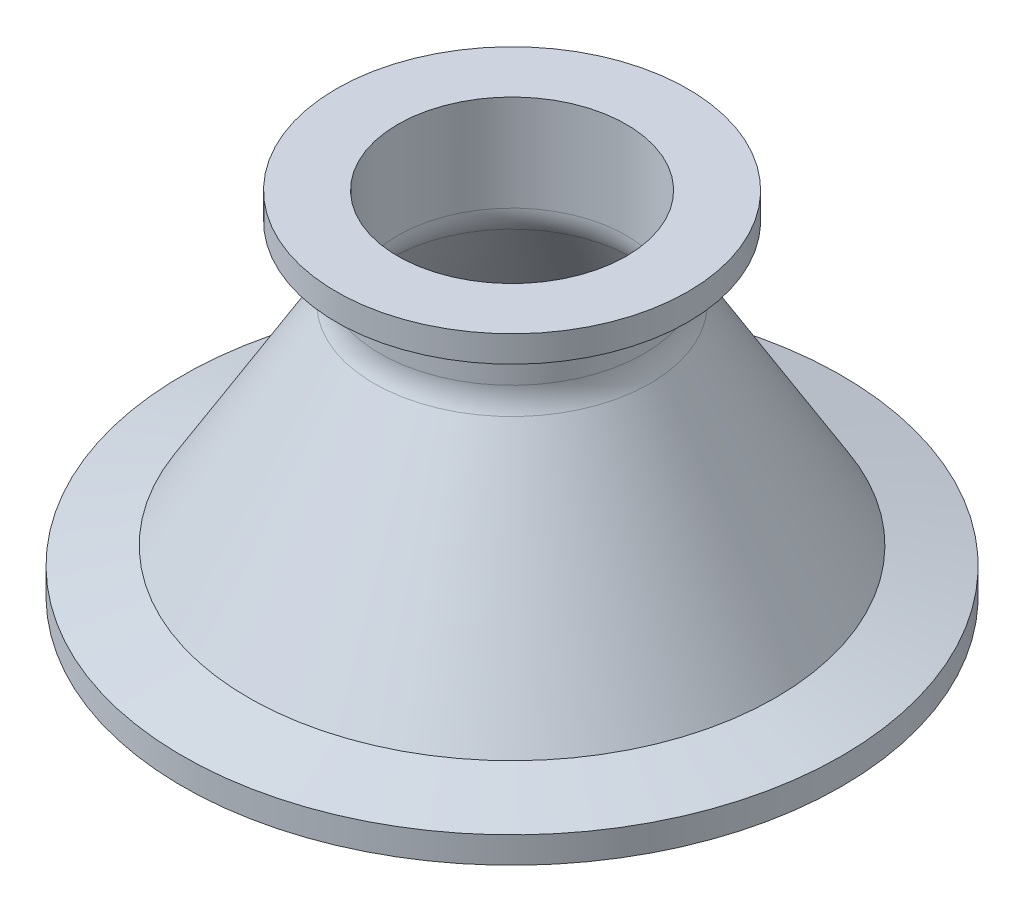
ISO-10303-21;
HEADER;
FILE_DESCRIPTION(('STEP AP214'),'2;1');
FILE_NAME('part.step','',(''),(''),'','','');
FILE_SCHEMA(('AUTOMOTIVE_DESIGN { 1 0 10303 214 1 1 1 1 }'));
ENDSEC;
DATA;
#1=APPLICATION_CONTEXT('core data for automotive mechanical design processes');
#2=APPLICATION_PROTOCOL_DEFINITION('international standard','automotive_design',2000,#1);
#3=PRODUCT_CONTEXT('',#1,'mechanical');
#4=PRODUCT('Part','Part','',(#3));
#5=PRODUCT_RELATED_PRODUCT_CATEGORY('part','',(#4));
#6=PRODUCT_DEFINITION_FORMATION('','',#4);
#7=PRODUCT_DEFINITION_CONTEXT('part definition',#1,'design');
#8=PRODUCT_DEFINITION('design','',#6,#7);
#9=PRODUCT_DEFINITION_SHAPE('','',#8);
#10=(LENGTH_UNIT() NAMED_UNIT(*) SI_UNIT(.MILLI.,.METRE.));
#11=(NAMED_UNIT(*) PLANE_ANGLE_UNIT() SI_UNIT($,.RADIAN.));
#12=(NAMED_UNIT(*) SI_UNIT($,.STERADIAN.) SOLID_ANGLE_UNIT());
#13=UNCERTAINTY_MEASURE_WITH_UNIT(LENGTH_MEASURE(1.E-05),#10,'distance_accuracy_value','');
#14=(GEOMETRIC_REPRESENTATION_CONTEXT(3) GLOBAL_UNCERTAINTY_ASSIGNED_CONTEXT((#13)) GLOBAL_UNIT_ASSIGNED_CONTEXT((#10,
#11,#12)) REPRESENTATION_CONTEXT('',''));
#15=CARTESIAN_POINT('',(0.,0.,0.));
#16=DIRECTION('',(0.,0.,1.));
#17=DIRECTION('',(1.,0.,0.));
#18=AXIS2_PLACEMENT_3D('',#15,#16,#17);
#19=CARTESIAN_POINT('',(0.,4.615080175258,0.));
#20=DIRECTION('',(0.,-1.,0.));
#21=DIRECTION('',(-0.999975299857432,0.,0.00702849023888623));
#22=AXIS2_PLACEMENT_3D('',#19,#20,#21);
#23=TOROIDAL_SURFACE('',#22,21.,5.);
#24=CARTESIAN_POINT('',(0.,7.187558952395,0.));
#25=DIRECTION('',(0.,-1.,0.));
#26=DIRECTION('',(1.,0.,0.));
#27=AXIS2_PLACEMENT_3D('',#24,#25,#26);
#28=CIRCLE('',#27,25.28746462856);
#29=CARTESIAN_POINT('',(25.2874646285601,7.18755895239509,0.));
#30=VERTEX_POINT('',#29);
#31=CARTESIAN_POINT('',(25.2868400245785,7.187558952395,-0.177732698308012));
#32=VERTEX_POINT('',#31);
#33=EDGE_CURVE('E192',#30,#32,#28,.T.);
#34=ORIENTED_EDGE('',*,*,#33,.F.);
#35=CARTESIAN_POINT('',(0.,7.187558952395,0.));
#36=DIRECTION('',(0.,-1.,0.));
#37=DIRECTION('',(1.,0.,0.));
#38=AXIS2_PLACEMENT_3D('',#35,#36,#37);
#39=CIRCLE('',#38,25.28746462856);
#40=EDGE_CURVE('E90',#32,#30,#39,.T.);
#41=ORIENTED_EDGE('',*,*,#40,.F.);
#42=CARTESIAN_POINT('',(20.9994812970061,4.615080175258,-0.147598295016608));
#43=DIRECTION('',(-0.00702849023888611,0.,-0.999975299857432));
#44=DIRECTION('',(0.999975299857432,0.,-0.00702849023888611));
#45=AXIS2_PLACEMENT_3D('',#42,#43,#44);
#46=CIRCLE('',#45,5.);
#47=CARTESIAN_POINT('',(25.9993577962932,4.615080175258,-0.182740746211039));
#48=VERTEX_POINT('',#47);
#49=EDGE_CURVE('E11',#32,#48,#46,.T.);
#50=ORIENTED_EDGE('',*,*,#49,.T.);
#51=CARTESIAN_POINT('',(0.,4.615080175258,0.));
#52=DIRECTION('',(0.,-1.,0.));
#53=DIRECTION('',(-1.,0.,0.));
#54=AXIS2_PLACEMENT_3D('',#51,#52,#53);
#55=CIRCLE('',#54,26.);
#56=CARTESIAN_POINT('',(26.,4.615080175258,0.));
#57=VERTEX_POINT('',#56);
#58=EDGE_CURVE('E28',#48,#57,#55,.T.);
#59=ORIENTED_EDGE('',*,*,#58,.T.);
#60=CARTESIAN_POINT('',(0.,4.615080175258,0.));
#61=DIRECTION('',(0.,-1.,0.));
#62=DIRECTION('',(-1.,0.,0.));
#63=AXIS2_PLACEMENT_3D('',#60,#61,#62);
#64=CIRCLE('',#63,26.);
#65=EDGE_CURVE('E198',#57,#48,#64,.T.);
#66=ORIENTED_EDGE('',*,*,#65,.T.);
#67=ORIENTED_EDGE('',*,*,#49,.F.);
#68=EDGE_LOOP('',(#34,#41,#50,#59,#66,#67));
#69=FACE_BOUND('',#68,.T.);
#70=ADVANCED_FACE('F17',(#69),#23,.F.);
#71=CARTESIAN_POINT('',(0.,42.,0.));
#72=DIRECTION('',(0.,-1.,0.));
#73=DIRECTION('',(-1.,0.,0.));
#74=AXIS2_PLACEMENT_3D('',#71,#72,#73);
#75=CYLINDRICAL_SURFACE('',#74,26.);
#76=ORIENTED_EDGE('',*,*,#65,.F.);
#77=DIRECTION('',(0.,-1.,0.));
#78=VECTOR('',#77,1.);
#79=CARTESIAN_POINT('',(26.,42.,0.));
#80=LINE('',#79,#78);
#81=CARTESIAN_POINT('',(26.,0.,0.));
#82=VERTEX_POINT('',#81);
#83=EDGE_CURVE('E194',#57,#82,#80,.T.);
#84=ORIENTED_EDGE('',*,*,#83,.T.);
#85=CARTESIAN_POINT('',(0.,0.,0.));
#86=DIRECTION('',(0.,1.,0.));
#87=DIRECTION('',(1.,0.,0.));
#88=AXIS2_PLACEMENT_3D('',#85,#86,#87);
#89=CIRCLE('',#88,26.);
#90=EDGE_CURVE('E184',#82,#82,#89,.T.);
#91=ORIENTED_EDGE('',*,*,#90,.F.);
#92=ORIENTED_EDGE('',*,*,#83,.F.);
#93=ORIENTED_EDGE('',*,*,#58,.F.);
#94=EDGE_LOOP('',(#76,#84,#91,#92,#93));
#95=FACE_BOUND('',#94,.T.);
#96=ADVANCED_FACE('F271',(#95),#75,.F.);
#97=CARTESIAN_POINT('',(0.,0.,0.));
#98=DIRECTION('',(0.,-1.,0.));
#99=DIRECTION('',(0.,0.,-1.));
#100=AXIS2_PLACEMENT_3D('',#97,#98,#99);
#101=PLANE('',#100);
#102=ORIENTED_EDGE('',*,*,#90,.T.);
#103=EDGE_LOOP('',(#102));
#104=FACE_BOUND('',#103,.T.);
#105=CARTESIAN_POINT('',(0.,0.,0.));
#106=DIRECTION('',(0.,1.,0.));
#107=DIRECTION('',(1.,0.,0.));
#108=AXIS2_PLACEMENT_3D('',#105,#106,#107);
#109=CIRCLE('',#108,37.5);
#110=CARTESIAN_POINT('',(37.5,0.,0.));
#111=VERTEX_POINT('',#110);
#112=EDGE_CURVE('E185',#111,#111,#109,.T.);
#113=ORIENTED_EDGE('',*,*,#112,.F.);
#114=EDGE_LOOP('',(#113));
#115=FACE_BOUND('',#114,.T.);
#116=ADVANCED_FACE('F273',(#104,#115),#101,.T.);
#117=CARTESIAN_POINT('',(0.,42.,0.));
#118=DIRECTION('',(0.,-1.,0.));
#119=DIRECTION('',(-1.,0.,0.));
#120=AXIS2_PLACEMENT_3D('',#117,#118,#119);
#121=CYLINDRICAL_SURFACE('',#120,37.5);
#122=ORIENTED_EDGE('',*,*,#112,.T.);
#123=DIRECTION('',(0.,1.,0.));
#124=VECTOR('',#123,1.);
#125=CARTESIAN_POINT('',(37.5,42.,0.));
#126=LINE('',#125,#124);
#127=CARTESIAN_POINT('',(37.5,2.99999999999984,0.));
#128=VERTEX_POINT('',#127);
#129=EDGE_CURVE('E182',#111,#128,#126,.T.);
#130=ORIENTED_EDGE('',*,*,#129,.T.);
#131=CARTESIAN_POINT('',(0.,3.,0.));
#132=DIRECTION('',(0.,1.,0.));
#133=DIRECTION('',(1.,0.,0.));
#134=AXIS2_PLACEMENT_3D('',#131,#132,#133);
#135=CIRCLE('',#134,37.5);
#136=EDGE_CURVE('E212',#128,#128,#135,.T.);
#137=ORIENTED_EDGE('',*,*,#136,.F.);
#138=ORIENTED_EDGE('',*,*,#129,.F.);
#139=EDGE_LOOP('',(#122,#130,#137,#138));
#140=FACE_BOUND('',#139,.T.);
#141=ADVANCED_FACE('F276',(#140),#121,.T.);
#142=CARTESIAN_POINT('',(0.,4.,0.));
#143=DIRECTION('',(0.,-1.,0.));
#144=DIRECTION('',(-1.,0.,0.));
#145=AXIS2_PLACEMENT_3D('',#142,#143,#144);
#146=CONICAL_SURFACE('',#145,33.75,1.31019393504751);
#147=ORIENTED_EDGE('',*,*,#136,.T.);
#148=DIRECTION('',(-0.966234939601235,0.257662650560374,0.));
#149=VECTOR('',#148,1.);
#150=CARTESIAN_POINT('',(33.75,4.,0.));
#151=LINE('',#150,#149);
#152=CARTESIAN_POINT('',(30.,5.,0.));
#153=VERTEX_POINT('',#152);
#154=EDGE_CURVE('E21',#128,#153,#151,.T.);
#155=ORIENTED_EDGE('',*,*,#154,.T.);
#156=CARTESIAN_POINT('',(0.,5.,0.));
#157=DIRECTION('',(0.,-1.,0.));
#158=DIRECTION('',(1.,0.,0.));
#159=AXIS2_PLACEMENT_3D('',#156,#157,#158);
#160=CIRCLE('',#159,30.);
#161=EDGE_CURVE('E178',#153,#153,#160,.T.);
#162=ORIENTED_EDGE('',*,*,#161,.T.);
#163=ORIENTED_EDGE('',*,*,#154,.F.);
#164=EDGE_LOOP('',(#147,#155,#162,#163));
#165=FACE_BOUND('',#164,.T.);
#166=ADVANCED_FACE('F281',(#165),#146,.T.);
#167=CARTESIAN_POINT('',(0.,16.9062205238,0.));
#168=DIRECTION('',(0.,-1.,0.));
#169=DIRECTION('',(-1.,0.,0.));
#170=AXIS2_PLACEMENT_3D('',#167,#168,#169);
#171=CONICAL_SURFACE('',#170,22.85626768572,0.540419500270523);
#172=ORIENTED_EDGE('',*,*,#161,.F.);
#173=DIRECTION('',(-0.514495755427474,0.857492925712576,0.));
#174=VECTOR('',#173,1.);
#175=CARTESIAN_POINT('',(22.85626768572,16.9062205238,0.));
#176=LINE('',#175,#174);
#177=CARTESIAN_POINT('',(15.7125353714407,28.8124410476004,0.));
#178=VERTEX_POINT('',#177);
#179=EDGE_CURVE('E181',#153,#178,#176,.T.);
#180=ORIENTED_EDGE('',*,*,#179,.T.);
#181=CARTESIAN_POINT('',(0.,28.8124410476,0.));
#182=DIRECTION('',(0.,-1.,0.));
#183=DIRECTION('',(-1.,0.,0.));
#184=AXIS2_PLACEMENT_3D('',#181,#182,#183);
#185=CIRCLE('',#184,15.71253537144);
#186=CARTESIAN_POINT('',(15.7120637266121,28.8124410476,-0.12174255473111));
#187=VERTEX_POINT('',#186);
#188=EDGE_CURVE('E230',#178,#187,#185,.T.);
#189=ORIENTED_EDGE('',*,*,#188,.T.);
#190=CARTESIAN_POINT('',(0.,28.8124410476,0.));
#191=DIRECTION('',(0.,-1.,0.));
#192=DIRECTION('',(-1.,0.,0.));
#193=AXIS2_PLACEMENT_3D('',#190,#191,#192);
#194=CIRCLE('',#193,15.71253537144);
#195=EDGE_CURVE('E242',#187,#178,#194,.T.);
#196=ORIENTED_EDGE('',*,*,#195,.T.);
#197=ORIENTED_EDGE('',*,*,#179,.F.);
#198=EDGE_LOOP('',(#172,#180,#189,#196,#197));
#199=FACE_BOUND('',#198,.T.);
#200=ADVANCED_FACE('F420',(#199),#171,.T.);
#201=CARTESIAN_POINT('',(0.,31.38491982474,0.));
#202=DIRECTION('',(0.,-1.,0.));
#203=DIRECTION('',(-0.999969982894758,0.,0.00774811651036267));
#204=AXIS2_PLACEMENT_3D('',#201,#202,#203);
#205=TOROIDAL_SURFACE('',#204,20.,5.);
#206=ORIENTED_EDGE('',*,*,#188,.F.);
#207=ORIENTED_EDGE('',*,*,#195,.F.);
#208=CARTESIAN_POINT('',(19.9993996578952,31.38491982474,-0.154962330207251));
#209=DIRECTION('',(-0.00774811651036255,0.,-0.999969982894758));
#210=DIRECTION('',(0.999969982894758,0.,-0.00774811651036255));
#211=AXIS2_PLACEMENT_3D('',#208,#209,#210);
#212=CIRCLE('',#211,5.);
#213=CARTESIAN_POINT('',(14.9995497434214,31.38491982474,-0.116221747655438));
#214=VERTEX_POINT('',#213);
#215=EDGE_CURVE('E129',#187,#214,#212,.T.);
#216=ORIENTED_EDGE('',*,*,#215,.T.);
#217=CARTESIAN_POINT('',(0.,31.38491982474,0.));
#218=DIRECTION('',(0.,-1.,0.));
#219=DIRECTION('',(-1.,0.,0.));
#220=AXIS2_PLACEMENT_3D('',#217,#218,#219);
#221=CIRCLE('',#220,15.);
#222=CARTESIAN_POINT('',(15.,31.38491982474,0.));
#223=VERTEX_POINT('',#222);
#224=EDGE_CURVE('E225',#214,#223,#221,.T.);
#225=ORIENTED_EDGE('',*,*,#224,.T.);
#226=CARTESIAN_POINT('',(0.,31.38491982474,0.));
#227=DIRECTION('',(0.,-1.,0.));
#228=DIRECTION('',(-1.,0.,0.));
#229=AXIS2_PLACEMENT_3D('',#226,#227,#228);
#230=CIRCLE('',#229,15.);
#231=EDGE_CURVE('E209',#223,#214,#230,.T.);
#232=ORIENTED_EDGE('',*,*,#231,.T.);
#233=ORIENTED_EDGE('',*,*,#215,.F.);
#234=EDGE_LOOP('',(#206,#207,#216,#225,#232,#233));
#235=FACE_BOUND('',#234,.T.);
#236=ADVANCED_FACE('F428',(#235),#205,.F.);
#237=CARTESIAN_POINT('',(0.,42.,0.));
#238=DIRECTION('',(0.,-1.,0.));
#239=DIRECTION('',(-1.,0.,0.));
#240=AXIS2_PLACEMENT_3D('',#237,#238,#239);
#241=CYLINDRICAL_SURFACE('',#240,15.);
#242=ORIENTED_EDGE('',*,*,#231,.F.);
#243=DIRECTION('',(0.,1.,0.));
#244=VECTOR('',#243,1.);
#245=CARTESIAN_POINT('',(15.,42.,0.));
#246=LINE('',#245,#244);
#247=CARTESIAN_POINT('',(15.,35.,0.));
#248=VERTEX_POINT('',#247);
#249=EDGE_CURVE('E105',#223,#248,#246,.T.);
#250=ORIENTED_EDGE('',*,*,#249,.T.);
#251=CARTESIAN_POINT('',(0.,35.,0.));
#252=DIRECTION('',(0.,1.,0.));
#253=DIRECTION('',(1.,0.,0.));
#254=AXIS2_PLACEMENT_3D('',#251,#252,#253);
#255=CIRCLE('',#254,15.);
#256=CARTESIAN_POINT('',(-15.,35.,0.));
#257=VERTEX_POINT('',#256);
#258=EDGE_CURVE('E154',#257,#248,#255,.T.);
#259=ORIENTED_EDGE('',*,*,#258,.F.);
#260=CARTESIAN_POINT('',(0.,35.,0.));
#261=DIRECTION('',(0.,1.,0.));
#262=DIRECTION('',(1.,0.,0.));
#263=AXIS2_PLACEMENT_3D('',#260,#261,#262);
#264=CIRCLE('',#263,15.);
#265=EDGE_CURVE('E118',#248,#257,#264,.T.);
#266=ORIENTED_EDGE('',*,*,#265,.F.);
#267=ORIENTED_EDGE('',*,*,#249,.F.);
#268=ORIENTED_EDGE('',*,*,#224,.F.);
#269=EDGE_LOOP('',(#242,#250,#259,#266,#267,#268));
#270=FACE_BOUND('',#269,.T.);
#271=ADVANCED_FACE('F403',(#270),#241,.T.);
#272=CARTESIAN_POINT('',(0.,36.,0.));
#273=DIRECTION('',(0.,1.,0.));
#274=DIRECTION('',(1.,0.,0.));
#275=AXIS2_PLACEMENT_3D('',#272,#273,#274);
#276=CONICAL_SURFACE('',#275,17.5,1.19028994968256);
#277=CARTESIAN_POINT('',(0.,37.,0.));
#278=DIRECTION('',(0.,1.,0.));
#279=DIRECTION('',(1.,0.,0.));
#280=AXIS2_PLACEMENT_3D('',#277,#278,#279);
#281=CIRCLE('',#280,20.);
#282=CARTESIAN_POINT('',(-20.,37.,0.));
#283=VERTEX_POINT('',#282);
#284=CARTESIAN_POINT('',(20.,37.,0.));
#285=VERTEX_POINT('',#284);
#286=EDGE_CURVE('E159',#283,#285,#281,.T.);
#287=ORIENTED_EDGE('',*,*,#286,.F.);
#288=DIRECTION('',(0.928476690885271,-0.371390676354074,0.));
#289=VECTOR('',#288,1.);
#290=CARTESIAN_POINT('',(-17.5,36.,0.));
#291=LINE('',#290,#289);
#292=EDGE_CURVE('E147',#283,#257,#291,.T.);
#293=ORIENTED_EDGE('',*,*,#292,.T.);
#294=ORIENTED_EDGE('',*,*,#258,.T.);
#295=ORIENTED_EDGE('',*,*,#265,.T.);
#296=ORIENTED_EDGE('',*,*,#292,.F.);
#297=CARTESIAN_POINT('',(0.,37.,0.));
#298=DIRECTION('',(0.,1.,0.));
#299=DIRECTION('',(1.,0.,0.));
#300=AXIS2_PLACEMENT_3D('',#297,#298,#299);
#301=CIRCLE('',#300,20.);
#302=EDGE_CURVE('E151',#285,#283,#301,.T.);
#303=ORIENTED_EDGE('',*,*,#302,.F.);
#304=EDGE_LOOP('',(#287,#293,#294,#295,#296,#303));
#305=FACE_BOUND('',#304,.T.);
#306=ADVANCED_FACE('F150',(#305),#276,.T.);
#307=CARTESIAN_POINT('',(0.,42.,0.));
#308=DIRECTION('',(0.,-1.,0.));
#309=DIRECTION('',(-1.,0.,0.));
#310=AXIS2_PLACEMENT_3D('',#307,#308,#309);
#311=CYLINDRICAL_SURFACE('',#310,20.);
#312=ORIENTED_EDGE('',*,*,#286,.T.);
#313=DIRECTION('',(0.,1.,0.));
#314=VECTOR('',#313,1.);
#315=CARTESIAN_POINT('',(20.,42.,0.));
#316=LINE('',#315,#314);
#317=CARTESIAN_POINT('',(20.,40.,0.));
#318=VERTEX_POINT('',#317);
#319=EDGE_CURVE('E161',#285,#318,#316,.T.);
#320=ORIENTED_EDGE('',*,*,#319,.T.);
#321=CARTESIAN_POINT('',(0.,40.,0.));
#322=DIRECTION('',(0.,1.,0.));
#323=DIRECTION('',(1.,0.,0.));
#324=AXIS2_PLACEMENT_3D('',#321,#322,#323);
#325=CIRCLE('',#324,20.);
#326=EDGE_CURVE('E165',#318,#318,#325,.T.);
#327=ORIENTED_EDGE('',*,*,#326,.F.);
#328=ORIENTED_EDGE('',*,*,#319,.F.);
#329=ORIENTED_EDGE('',*,*,#302,.T.);
#330=EDGE_LOOP('',(#312,#320,#327,#328,#329));
#331=FACE_BOUND('',#330,.T.);
#332=ADVANCED_FACE('F158',(#331),#311,.T.);
#333=CARTESIAN_POINT('',(0.,40.,0.));
#334=DIRECTION('',(0.,-1.,0.));
#335=DIRECTION('',(0.,0.,-1.));
#336=AXIS2_PLACEMENT_3D('',#333,#334,#335);
#337=PLANE('',#336);
#338=CARTESIAN_POINT('',(0.,40.,0.));
#339=DIRECTION('',(0.,-1.,0.));
#340=DIRECTION('',(1.,0.,0.));
#341=AXIS2_PLACEMENT_3D('',#338,#339,#340);
#342=CIRCLE('',#341,13.);
#343=CARTESIAN_POINT('',(13.,40.,0.));
#344=VERTEX_POINT('',#343);
#345=EDGE_CURVE('E223',#344,#344,#342,.T.);
#346=ORIENTED_EDGE('',*,*,#345,.T.);
#347=EDGE_LOOP('',(#346));
#348=FACE_BOUND('',#347,.T.);
#349=ORIENTED_EDGE('',*,*,#326,.T.);
#350=EDGE_LOOP('',(#349));
#351=FACE_BOUND('',#350,.T.);
#352=ADVANCED_FACE('F468',(#348,#351),#337,.F.);
#353=CARTESIAN_POINT('',(0.,16.83333333333,0.));
#354=DIRECTION('',(0.,-1.,0.));
#355=DIRECTION('',(-1.,0.,0.));
#356=AXIS2_PLACEMENT_3D('',#353,#354,#355);
#357=CONICAL_SURFACE('',#356,19.5,0.540419500270523);
#358=CARTESIAN_POINT('',(0.,26.47910771427,0.));
#359=DIRECTION('',(0.,1.,0.));
#360=DIRECTION('',(-1.,0.,0.));
#361=AXIS2_PLACEMENT_3D('',#358,#359,#360);
#362=CIRCLE('',#361,13.71253537144);
#363=CARTESIAN_POINT('',(13.71253537144,26.47910771427,0.));
#364=VERTEX_POINT('',#363);
#365=CARTESIAN_POINT('',(13.7120287257454,26.47910771427,0.117875092049843));
#366=VERTEX_POINT('',#365);
#367=EDGE_CURVE('E213',#364,#366,#362,.T.);
#368=ORIENTED_EDGE('',*,*,#367,.T.);
#369=CARTESIAN_POINT('',(0.,26.47910771427,0.));
#370=DIRECTION('',(0.,1.,0.));
#371=DIRECTION('',(-1.,0.,0.));
#372=AXIS2_PLACEMENT_3D('',#369,#370,#371);
#373=CIRCLE('',#372,13.71253537144);
#374=EDGE_CURVE('E193',#366,#364,#373,.T.);
#375=ORIENTED_EDGE('',*,*,#374,.T.);
#376=DIRECTION('',(0.514495755427474,-0.857492925712576,0.));
#377=VECTOR('',#376,1.);
#378=CARTESIAN_POINT('',(19.5,16.83333333333,0.));
#379=LINE('',#378,#377);
#380=EDGE_CURVE('E82',#364,#30,#379,.T.);
#381=ORIENTED_EDGE('',*,*,#380,.T.);
#382=ORIENTED_EDGE('',*,*,#33,.T.);
#383=ORIENTED_EDGE('',*,*,#40,.T.);
#384=ORIENTED_EDGE('',*,*,#380,.F.);
#385=EDGE_LOOP('',(#368,#375,#381,#382,#383,#384));
#386=FACE_BOUND('',#385,.T.);
#387=ADVANCED_FACE('F448',(#386),#357,.F.);
#388=CARTESIAN_POINT('',(0.,29.05158649141,0.));
#389=DIRECTION('',(0.,-1.,0.));
#390=DIRECTION('',(-0.999963052369174,0.,-0.00859615591550979));
#391=AXIS2_PLACEMENT_3D('',#388,#389,#390);
#392=TOROIDAL_SURFACE('',#391,18.,5.);
#393=CARTESIAN_POINT('',(0.,29.05158649141,0.));
#394=DIRECTION('',(0.,1.,0.));
#395=DIRECTION('',(-1.,0.,0.));
#396=AXIS2_PLACEMENT_3D('',#393,#394,#395);
#397=CIRCLE('',#396,13.);
#398=CARTESIAN_POINT('',(13.,29.05158649141,0.));
#399=VERTEX_POINT('',#398);
#400=CARTESIAN_POINT('',(12.9995196807993,29.05158649141,0.111750026901629));
#401=VERTEX_POINT('',#400);
#402=EDGE_CURVE('E203',#399,#401,#397,.T.);
#403=ORIENTED_EDGE('',*,*,#402,.T.);
#404=CARTESIAN_POINT('',(17.9993349426451,29.05158649141,0.154730806479178));
#405=DIRECTION('',(-0.00859615591550991,0.,0.999963052369174));
#406=DIRECTION('',(0.999963052369174,0.,0.00859615591550991));
#407=AXIS2_PLACEMENT_3D('',#404,#405,#406);
#408=CIRCLE('',#407,5.);
#409=EDGE_CURVE('E177',#401,#366,#408,.T.);
#410=ORIENTED_EDGE('',*,*,#409,.T.);
#411=ORIENTED_EDGE('',*,*,#367,.F.);
#412=ORIENTED_EDGE('',*,*,#374,.F.);
#413=ORIENTED_EDGE('',*,*,#409,.F.);
#414=CARTESIAN_POINT('',(0.,29.05158649141,0.));
#415=DIRECTION('',(0.,1.,0.));
#416=DIRECTION('',(-1.,0.,0.));
#417=AXIS2_PLACEMENT_3D('',#414,#415,#416);
#418=CIRCLE('',#417,13.);
#419=EDGE_CURVE('E199',#401,#399,#418,.T.);
#420=ORIENTED_EDGE('',*,*,#419,.T.);
#421=EDGE_LOOP('',(#403,#410,#411,#412,#413,#420));
#422=FACE_BOUND('',#421,.T.);
#423=ADVANCED_FACE('F383',(#422),#392,.T.);
#424=CARTESIAN_POINT('',(0.,42.,0.));
#425=DIRECTION('',(0.,-1.,0.));
#426=DIRECTION('',(-1.,0.,0.));
#427=AXIS2_PLACEMENT_3D('',#424,#425,#426);
#428=CYLINDRICAL_SURFACE('',#427,13.);
#429=ORIENTED_EDGE('',*,*,#345,.F.);
#430=DIRECTION('',(0.,-1.,0.));
#431=VECTOR('',#430,1.);
#432=CARTESIAN_POINT('',(13.,42.,0.));
#433=LINE('',#432,#431);
#434=EDGE_CURVE('E204',#344,#399,#433,.T.);
#435=ORIENTED_EDGE('',*,*,#434,.T.);
#436=ORIENTED_EDGE('',*,*,#419,.F.);
#437=ORIENTED_EDGE('',*,*,#402,.F.);
#438=ORIENTED_EDGE('',*,*,#434,.F.);
#439=EDGE_LOOP('',(#429,#435,#436,#437,#438));
#440=FACE_BOUND('',#439,.T.);
#441=ADVANCED_FACE('F19',(#440),#428,.F.);
#442=CLOSED_SHELL('',(#70,#96,#116,#141,#166,#200,#236,#271,#306,#332,#352,#387,#423,#441));
#443=MANIFOLD_SOLID_BREP('B1',#442);
#444=ADVANCED_BREP_SHAPE_REPRESENTATION('',(#18,#443),#14);
#445=SHAPE_DEFINITION_REPRESENTATION(#9,#444);
ENDSEC;
END-ISO-10303-21;
